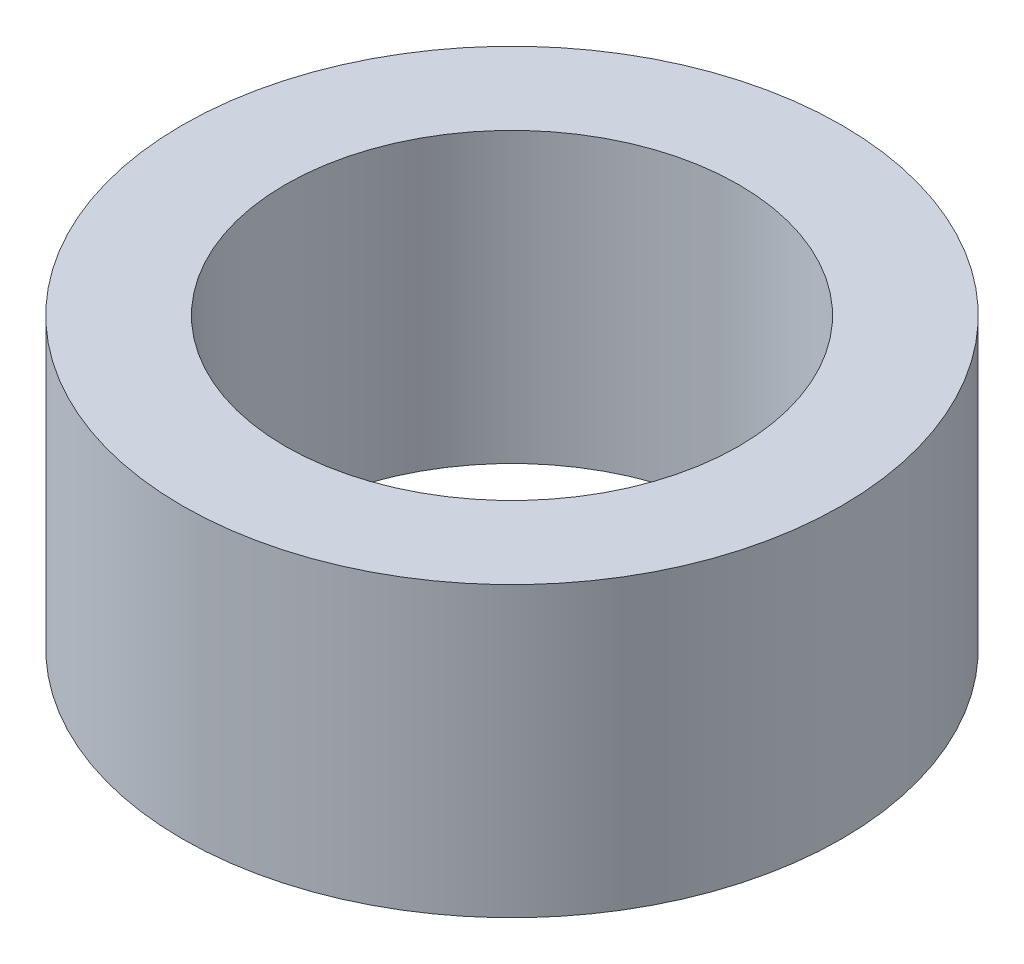
ISO-10303-21;
HEADER;
FILE_DESCRIPTION(('STEP AP214'),'2;1');
FILE_NAME('part.step','',(''),(''),'','','');
FILE_SCHEMA(('AUTOMOTIVE_DESIGN { 1 0 10303 214 1 1 1 1 }'));
ENDSEC;
DATA;
#1=APPLICATION_CONTEXT('core data for automotive mechanical design processes');
#2=APPLICATION_PROTOCOL_DEFINITION('international standard','automotive_design',2000,#1);
#3=PRODUCT_CONTEXT('',#1,'mechanical');
#4=PRODUCT('Part','Part','',(#3));
#5=PRODUCT_RELATED_PRODUCT_CATEGORY('part','',(#4));
#6=PRODUCT_DEFINITION_FORMATION('','',#4);
#7=PRODUCT_DEFINITION_CONTEXT('part definition',#1,'design');
#8=PRODUCT_DEFINITION('design','',#6,#7);
#9=PRODUCT_DEFINITION_SHAPE('','',#8);
#10=(LENGTH_UNIT() NAMED_UNIT(*) SI_UNIT(.MILLI.,.METRE.));
#11=(NAMED_UNIT(*) PLANE_ANGLE_UNIT() SI_UNIT($,.RADIAN.));
#12=(NAMED_UNIT(*) SI_UNIT($,.STERADIAN.) SOLID_ANGLE_UNIT());
#13=UNCERTAINTY_MEASURE_WITH_UNIT(LENGTH_MEASURE(1.E-05),#10,'distance_accuracy_value','');
#14=(GEOMETRIC_REPRESENTATION_CONTEXT(3) GLOBAL_UNCERTAINTY_ASSIGNED_CONTEXT((#13)) GLOBAL_UNIT_ASSIGNED_CONTEXT((#10,
#11,#12)) REPRESENTATION_CONTEXT('',''));
#15=CARTESIAN_POINT('',(0.,0.,0.));
#16=DIRECTION('',(0.,0.,1.));
#17=DIRECTION('',(1.,0.,0.));
#18=AXIS2_PLACEMENT_3D('',#15,#16,#17);
#19=CARTESIAN_POINT('',(0.,7.,0.));
#20=DIRECTION('',(0.,1.,0.));
#21=DIRECTION('',(0.,0.,1.));
#22=AXIS2_PLACEMENT_3D('',#19,#20,#21);
#23=PLANE('',#22);
#24=CARTESIAN_POINT('',(0.,7.,0.));
#25=DIRECTION('',(0.,1.,0.));
#26=DIRECTION('',(0.,0.,1.));
#27=AXIS2_PLACEMENT_3D('',#24,#25,#26);
#28=CIRCLE('',#27,8.);
#29=CARTESIAN_POINT('',(0.,7.,8.));
#30=VERTEX_POINT('',#29);
#31=EDGE_CURVE('E10',#30,#30,#28,.T.);
#32=ORIENTED_EDGE('',*,*,#31,.T.);
#33=EDGE_LOOP('',(#32));
#34=FACE_BOUND('',#33,.T.);
#35=CARTESIAN_POINT('',(0.,7.,0.));
#36=DIRECTION('',(0.,1.,0.));
#37=DIRECTION('',(0.,0.,1.));
#38=AXIS2_PLACEMENT_3D('',#35,#36,#37);
#39=CIRCLE('',#38,5.5);
#40=CARTESIAN_POINT('',(0.,7.,5.5));
#41=VERTEX_POINT('',#40);
#42=EDGE_CURVE('E45',#41,#41,#39,.T.);
#43=ORIENTED_EDGE('',*,*,#42,.F.);
#44=EDGE_LOOP('',(#43));
#45=FACE_BOUND('',#44,.T.);
#46=ADVANCED_FACE('F34',(#34,#45),#23,.T.);
#47=CARTESIAN_POINT('',(0.,0.,0.));
#48=DIRECTION('',(0.,1.,0.));
#49=DIRECTION('',(0.,0.,1.));
#50=AXIS2_PLACEMENT_3D('',#47,#48,#49);
#51=PLANE('',#50);
#52=CARTESIAN_POINT('',(0.,0.,0.));
#53=DIRECTION('',(0.,1.,0.));
#54=DIRECTION('',(0.,0.,1.));
#55=AXIS2_PLACEMENT_3D('',#52,#53,#54);
#56=CIRCLE('',#55,8.);
#57=CARTESIAN_POINT('',(0.,0.,8.));
#58=VERTEX_POINT('',#57);
#59=EDGE_CURVE('E38',#58,#58,#56,.T.);
#60=ORIENTED_EDGE('',*,*,#59,.F.);
#61=EDGE_LOOP('',(#60));
#62=FACE_BOUND('',#61,.T.);
#63=CARTESIAN_POINT('',(0.,0.,0.));
#64=DIRECTION('',(0.,1.,0.));
#65=DIRECTION('',(0.,0.,1.));
#66=AXIS2_PLACEMENT_3D('',#63,#64,#65);
#67=CIRCLE('',#66,5.5);
#68=CARTESIAN_POINT('',(0.,0.,5.5));
#69=VERTEX_POINT('',#68);
#70=EDGE_CURVE('E47',#69,#69,#67,.T.);
#71=ORIENTED_EDGE('',*,*,#70,.T.);
#72=EDGE_LOOP('',(#71));
#73=FACE_BOUND('',#72,.T.);
#74=ADVANCED_FACE('F57',(#62,#73),#51,.F.);
#75=CARTESIAN_POINT('',(0.,7.,0.));
#76=DIRECTION('',(0.,-1.,0.));
#77=DIRECTION('',(0.,0.,-1.));
#78=AXIS2_PLACEMENT_3D('',#75,#76,#77);
#79=CYLINDRICAL_SURFACE('',#78,8.);
#80=ORIENTED_EDGE('',*,*,#31,.F.);
#81=EDGE_LOOP('',(#80));
#82=FACE_BOUND('',#81,.T.);
#83=ORIENTED_EDGE('',*,*,#59,.T.);
#84=EDGE_LOOP('',(#83));
#85=FACE_BOUND('',#84,.T.);
#86=ADVANCED_FACE('F36',(#82,#85),#79,.T.);
#87=CARTESIAN_POINT('',(0.,7.,0.));
#88=DIRECTION('',(0.,-1.,0.));
#89=DIRECTION('',(0.,0.,-1.));
#90=AXIS2_PLACEMENT_3D('',#87,#88,#89);
#91=CYLINDRICAL_SURFACE('',#90,5.5);
#92=ORIENTED_EDGE('',*,*,#42,.T.);
#93=EDGE_LOOP('',(#92));
#94=FACE_BOUND('',#93,.T.);
#95=ORIENTED_EDGE('',*,*,#70,.F.);
#96=EDGE_LOOP('',(#95));
#97=FACE_BOUND('',#96,.T.);
#98=ADVANCED_FACE('F53',(#94,#97),#91,.F.);
#99=CLOSED_SHELL('',(#46,#74,#86,#98));
#100=MANIFOLD_SOLID_BREP('B2',#99);
#101=ADVANCED_BREP_SHAPE_REPRESENTATION('',(#18,#100),#14);
#102=SHAPE_DEFINITION_REPRESENTATION(#9,#101);
ENDSEC;
END-ISO-10303-21;
